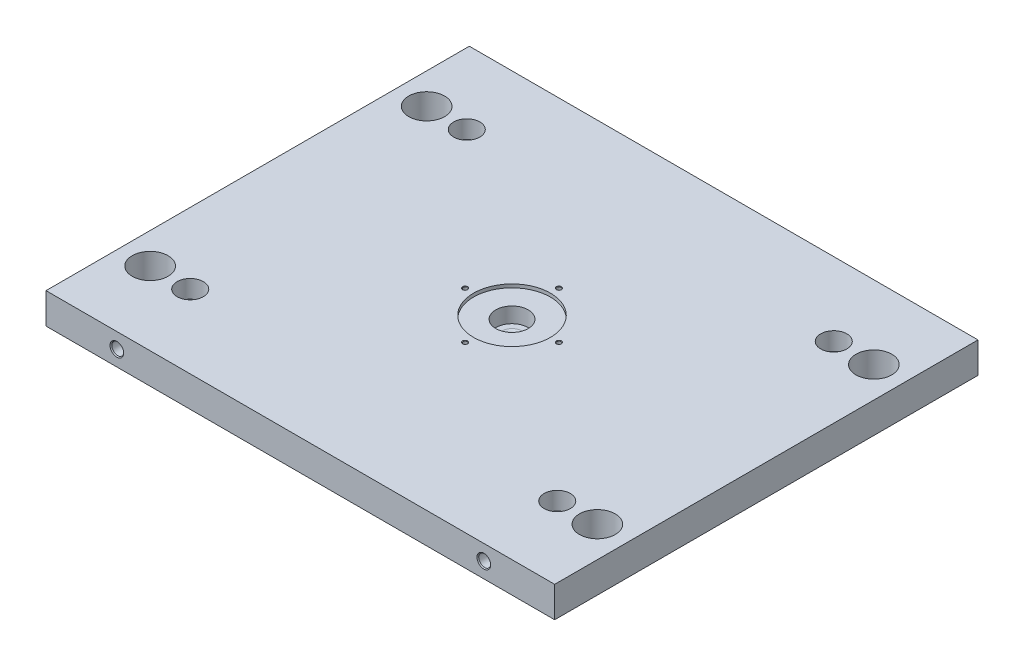
ISO-10303-21;
HEADER;
FILE_DESCRIPTION(('STEP AP214'),'2;1');
FILE_NAME('part.step','',(''),(''),'','','');
FILE_SCHEMA(('AUTOMOTIVE_DESIGN { 1 0 10303 214 1 1 1 1 }'));
ENDSEC;
DATA;
#1=APPLICATION_CONTEXT('core data for automotive mechanical design processes');
#2=APPLICATION_PROTOCOL_DEFINITION('international standard','automotive_design',2000,#1);
#3=PRODUCT_CONTEXT('',#1,'mechanical');
#4=PRODUCT('Part','Part','',(#3));
#5=PRODUCT_RELATED_PRODUCT_CATEGORY('part','',(#4));
#6=PRODUCT_DEFINITION_FORMATION('','',#4);
#7=PRODUCT_DEFINITION_CONTEXT('part definition',#1,'design');
#8=PRODUCT_DEFINITION('design','',#6,#7);
#9=PRODUCT_DEFINITION_SHAPE('','',#8);
#10=(LENGTH_UNIT() NAMED_UNIT(*) SI_UNIT(.MILLI.,.METRE.));
#11=(NAMED_UNIT(*) PLANE_ANGLE_UNIT() SI_UNIT($,.RADIAN.));
#12=(NAMED_UNIT(*) SI_UNIT($,.STERADIAN.) SOLID_ANGLE_UNIT());
#13=UNCERTAINTY_MEASURE_WITH_UNIT(LENGTH_MEASURE(1.E-05),#10,'distance_accuracy_value','');
#14=(GEOMETRIC_REPRESENTATION_CONTEXT(3) GLOBAL_UNCERTAINTY_ASSIGNED_CONTEXT((#13)) GLOBAL_UNIT_ASSIGNED_CONTEXT((#10,
#11,#12)) REPRESENTATION_CONTEXT('',''));
#15=CARTESIAN_POINT('',(0.,0.,0.));
#16=DIRECTION('',(0.,0.,1.));
#17=DIRECTION('',(1.,0.,0.));
#18=AXIS2_PLACEMENT_3D('',#15,#16,#17);
#19=CARTESIAN_POINT('',(298.,-36.,-248.));
#20=DIRECTION('',(0.,1.,0.));
#21=DIRECTION('',(0.,0.,1.));
#22=AXIS2_PLACEMENT_3D('',#19,#20,#21);
#23=CYLINDRICAL_SURFACE('',#22,8.99999999999999);
#24=CARTESIAN_POINT('',(298.,-25.,-248.));
#25=DIRECTION('',(0.,1.,0.));
#26=DIRECTION('',(0.,0.,1.));
#27=AXIS2_PLACEMENT_3D('',#24,#25,#26);
#28=CIRCLE('',#27,8.99999999999999);
#29=CARTESIAN_POINT('',(298.,-25.,-239.));
#30=VERTEX_POINT('',#29);
#31=EDGE_CURVE('E64',#30,#30,#28,.T.);
#32=ORIENTED_EDGE('',*,*,#31,.T.);
#33=EDGE_LOOP('',(#32));
#34=FACE_BOUND('',#33,.T.);
#35=CARTESIAN_POINT('',(298.,-36.,-248.));
#36=DIRECTION('',(0.,1.,0.));
#37=DIRECTION('',(0.,0.,1.));
#38=AXIS2_PLACEMENT_3D('',#35,#36,#37);
#39=CIRCLE('',#38,8.99999999999999);
#40=CARTESIAN_POINT('',(298.,-36.,-239.));
#41=VERTEX_POINT('',#40);
#42=EDGE_CURVE('E198',#41,#41,#39,.T.);
#43=ORIENTED_EDGE('',*,*,#42,.F.);
#44=EDGE_LOOP('',(#43));
#45=FACE_BOUND('',#44,.T.);
#46=ADVANCED_FACE('F55',(#34,#45),#23,.F.);
#47=CARTESIAN_POINT('',(596.,-36.,-2.22044604925031E-13));
#48=DIRECTION('',(-1.,0.,0.));
#49=DIRECTION('',(0.,0.,1.));
#50=AXIS2_PLACEMENT_3D('',#47,#48,#49);
#51=PLANE('',#50);
#52=DIRECTION('',(0.,0.,1.));
#53=VECTOR('',#52,1.);
#54=CARTESIAN_POINT('',(596.,0.,-2.22044604925031E-13));
#55=LINE('',#54,#53);
#56=CARTESIAN_POINT('',(596.,0.,-496.));
#57=VERTEX_POINT('',#56);
#58=CARTESIAN_POINT('',(596.,0.,0.));
#59=VERTEX_POINT('',#58);
#60=EDGE_CURVE('E283',#57,#59,#55,.T.);
#61=ORIENTED_EDGE('',*,*,#60,.T.);
#62=DIRECTION('',(0.,1.,0.));
#63=VECTOR('',#62,1.);
#64=CARTESIAN_POINT('',(596.,-36.,0.));
#65=LINE('',#64,#63);
#66=CARTESIAN_POINT('',(596.,-36.,0.));
#67=VERTEX_POINT('',#66);
#68=EDGE_CURVE('E97',#67,#59,#65,.T.);
#69=ORIENTED_EDGE('',*,*,#68,.F.);
#70=DIRECTION('',(0.,0.,1.));
#71=VECTOR('',#70,1.);
#72=CARTESIAN_POINT('',(596.,-36.,-2.22044604925031E-13));
#73=LINE('',#72,#71);
#74=CARTESIAN_POINT('',(596.,-36.,-496.));
#75=VERTEX_POINT('',#74);
#76=EDGE_CURVE('E72',#75,#67,#73,.T.);
#77=ORIENTED_EDGE('',*,*,#76,.F.);
#78=DIRECTION('',(0.,1.,0.));
#79=VECTOR('',#78,1.);
#80=CARTESIAN_POINT('',(596.,-36.,-496.));
#81=LINE('',#80,#79);
#82=EDGE_CURVE('E277',#75,#57,#81,.T.);
#83=ORIENTED_EDGE('',*,*,#82,.T.);
#84=EDGE_LOOP('',(#61,#69,#77,#83));
#85=FACE_BOUND('',#84,.T.);
#86=ADVANCED_FACE('F323',(#85),#51,.F.);
#87=CARTESIAN_POINT('',(0.,-36.,0.));
#88=DIRECTION('',(0.,0.,1.));
#89=DIRECTION('',(1.,0.,0.));
#90=AXIS2_PLACEMENT_3D('',#87,#88,#89);
#91=PLANE('',#90);
#92=CARTESIAN_POINT('',(83.,-18.,0.));
#93=DIRECTION('',(0.,0.,1.));
#94=DIRECTION('',(1.,0.,0.));
#95=AXIS2_PLACEMENT_3D('',#92,#93,#94);
#96=CIRCLE('',#95,8.025);
#97=CARTESIAN_POINT('',(91.025,-18.,0.));
#98=VERTEX_POINT('',#97);
#99=EDGE_CURVE('E143',#98,#98,#96,.T.);
#100=ORIENTED_EDGE('',*,*,#99,.F.);
#101=EDGE_LOOP('',(#100));
#102=FACE_BOUND('',#101,.T.);
#103=CARTESIAN_POINT('',(513.,-18.,0.));
#104=DIRECTION('',(0.,0.,1.));
#105=DIRECTION('',(1.,0.,0.));
#106=AXIS2_PLACEMENT_3D('',#103,#104,#105);
#107=CIRCLE('',#106,8.02499999999995);
#108=CARTESIAN_POINT('',(521.025,-18.,0.));
#109=VERTEX_POINT('',#108);
#110=EDGE_CURVE('E136',#109,#109,#107,.T.);
#111=ORIENTED_EDGE('',*,*,#110,.F.);
#112=EDGE_LOOP('',(#111));
#113=FACE_BOUND('',#112,.T.);
#114=DIRECTION('',(1.,0.,0.));
#115=VECTOR('',#114,1.);
#116=CARTESIAN_POINT('',(0.,0.,0.));
#117=LINE('',#116,#115);
#118=CARTESIAN_POINT('',(0.,0.,0.));
#119=VERTEX_POINT('',#118);
#120=EDGE_CURVE('E289',#119,#59,#117,.T.);
#121=ORIENTED_EDGE('',*,*,#120,.F.);
#122=DIRECTION('',(0.,1.,0.));
#123=VECTOR('',#122,1.);
#124=CARTESIAN_POINT('',(0.,-36.,0.));
#125=LINE('',#124,#123);
#126=CARTESIAN_POINT('',(0.,-36.,0.));
#127=VERTEX_POINT('',#126);
#128=EDGE_CURVE('E90',#127,#119,#125,.T.);
#129=ORIENTED_EDGE('',*,*,#128,.F.);
#130=DIRECTION('',(1.,0.,0.));
#131=VECTOR('',#130,1.);
#132=CARTESIAN_POINT('',(0.,-36.,0.));
#133=LINE('',#132,#131);
#134=EDGE_CURVE('E269',#127,#67,#133,.T.);
#135=ORIENTED_EDGE('',*,*,#134,.T.);
#136=ORIENTED_EDGE('',*,*,#68,.T.);
#137=EDGE_LOOP('',(#121,#129,#135,#136));
#138=FACE_BOUND('',#137,.T.);
#139=ADVANCED_FACE('F328',(#102,#113,#138),#91,.T.);
#140=CARTESIAN_POINT('',(0.,-36.,0.));
#141=DIRECTION('',(-1.,0.,0.));
#142=DIRECTION('',(0.,0.,1.));
#143=AXIS2_PLACEMENT_3D('',#140,#141,#142);
#144=PLANE('',#143);
#145=DIRECTION('',(0.,0.,1.));
#146=VECTOR('',#145,1.);
#147=CARTESIAN_POINT('',(0.,0.,0.));
#148=LINE('',#147,#146);
#149=CARTESIAN_POINT('',(0.,0.,-496.));
#150=VERTEX_POINT('',#149);
#151=EDGE_CURVE('E287',#150,#119,#148,.T.);
#152=ORIENTED_EDGE('',*,*,#151,.F.);
#153=DIRECTION('',(0.,1.,0.));
#154=VECTOR('',#153,1.);
#155=CARTESIAN_POINT('',(0.,-36.,-496.));
#156=LINE('',#155,#154);
#157=CARTESIAN_POINT('',(0.,-36.,-496.));
#158=VERTEX_POINT('',#157);
#159=EDGE_CURVE('E299',#158,#150,#156,.T.);
#160=ORIENTED_EDGE('',*,*,#159,.F.);
#161=DIRECTION('',(0.,0.,1.));
#162=VECTOR('',#161,1.);
#163=CARTESIAN_POINT('',(0.,-36.,0.));
#164=LINE('',#163,#162);
#165=EDGE_CURVE('E267',#158,#127,#164,.T.);
#166=ORIENTED_EDGE('',*,*,#165,.T.);
#167=ORIENTED_EDGE('',*,*,#128,.T.);
#168=EDGE_LOOP('',(#152,#160,#166,#167));
#169=FACE_BOUND('',#168,.T.);
#170=ADVANCED_FACE('F406',(#169),#144,.T.);
#171=CARTESIAN_POINT('',(560.,-36.,-86.0000000000001));
#172=DIRECTION('',(0.,1.,0.));
#173=DIRECTION('',(0.,0.,1.));
#174=AXIS2_PLACEMENT_3D('',#171,#172,#173);
#175=CYLINDRICAL_SURFACE('',#174,21.);
#176=CARTESIAN_POINT('',(560.,-36.,-86.0000000000001));
#177=DIRECTION('',(0.,1.,0.));
#178=DIRECTION('',(0.,0.,1.));
#179=AXIS2_PLACEMENT_3D('',#176,#177,#178);
#180=CIRCLE('',#179,21.);
#181=CARTESIAN_POINT('',(560.,-36.,-65.0000000000001));
#182=VERTEX_POINT('',#181);
#183=EDGE_CURVE('E271',#182,#182,#180,.T.);
#184=ORIENTED_EDGE('',*,*,#183,.F.);
#185=EDGE_LOOP('',(#184));
#186=FACE_BOUND('',#185,.T.);
#187=CARTESIAN_POINT('',(560.,0.,-86.0000000000001));
#188=DIRECTION('',(0.,1.,0.));
#189=DIRECTION('',(0.,0.,1.));
#190=AXIS2_PLACEMENT_3D('',#187,#188,#189);
#191=CIRCLE('',#190,21.);
#192=CARTESIAN_POINT('',(560.,0.,-65.0000000000001));
#193=VERTEX_POINT('',#192);
#194=EDGE_CURVE('E292',#193,#193,#191,.T.);
#195=ORIENTED_EDGE('',*,*,#194,.T.);
#196=EDGE_LOOP('',(#195));
#197=FACE_BOUND('',#196,.T.);
#198=ADVANCED_FACE('F402',(#186,#197),#175,.F.);
#199=CARTESIAN_POINT('',(0.,-36.,-496.));
#200=DIRECTION('',(0.,0.,1.));
#201=DIRECTION('',(1.,0.,0.));
#202=AXIS2_PLACEMENT_3D('',#199,#200,#201);
#203=PLANE('',#202);
#204=DIRECTION('',(1.,0.,0.));
#205=VECTOR('',#204,1.);
#206=CARTESIAN_POINT('',(0.,0.,-496.));
#207=LINE('',#206,#205);
#208=EDGE_CURVE('E285',#150,#57,#207,.T.);
#209=ORIENTED_EDGE('',*,*,#208,.T.);
#210=ORIENTED_EDGE('',*,*,#82,.F.);
#211=DIRECTION('',(1.,0.,0.));
#212=VECTOR('',#211,1.);
#213=CARTESIAN_POINT('',(0.,-36.,-496.));
#214=LINE('',#213,#212);
#215=EDGE_CURVE('E102',#158,#75,#214,.T.);
#216=ORIENTED_EDGE('',*,*,#215,.F.);
#217=ORIENTED_EDGE('',*,*,#159,.T.);
#218=EDGE_LOOP('',(#209,#210,#216,#217));
#219=FACE_BOUND('',#218,.T.);
#220=ADVANCED_FACE('F405',(#219),#203,.F.);
#221=CARTESIAN_POINT('',(36.0000000000001,-36.,-410.));
#222=DIRECTION('',(0.,1.,0.));
#223=DIRECTION('',(0.,0.,1.));
#224=AXIS2_PLACEMENT_3D('',#221,#222,#223);
#225=CYLINDRICAL_SURFACE('',#224,21.);
#226=CARTESIAN_POINT('',(36.0000000000001,-36.,-410.));
#227=DIRECTION('',(0.,1.,0.));
#228=DIRECTION('',(0.,0.,1.));
#229=AXIS2_PLACEMENT_3D('',#226,#227,#228);
#230=CIRCLE('',#229,21.);
#231=CARTESIAN_POINT('',(36.0000000000001,-36.,-389.));
#232=VERTEX_POINT('',#231);
#233=EDGE_CURVE('E261',#232,#232,#230,.T.);
#234=ORIENTED_EDGE('',*,*,#233,.F.);
#235=EDGE_LOOP('',(#234));
#236=FACE_BOUND('',#235,.T.);
#237=CARTESIAN_POINT('',(36.0000000000001,0.,-410.));
#238=DIRECTION('',(0.,1.,0.));
#239=DIRECTION('',(0.,0.,1.));
#240=AXIS2_PLACEMENT_3D('',#237,#238,#239);
#241=CIRCLE('',#240,21.);
#242=CARTESIAN_POINT('',(36.0000000000001,0.,-389.));
#243=VERTEX_POINT('',#242);
#244=EDGE_CURVE('E280',#243,#243,#241,.T.);
#245=ORIENTED_EDGE('',*,*,#244,.T.);
#246=EDGE_LOOP('',(#245));
#247=FACE_BOUND('',#246,.T.);
#248=ADVANCED_FACE('F414',(#236,#247),#225,.F.);
#249=CARTESIAN_POINT('',(560.,-36.,-410.));
#250=DIRECTION('',(0.,1.,0.));
#251=DIRECTION('',(0.,0.,1.));
#252=AXIS2_PLACEMENT_3D('',#249,#250,#251);
#253=CYLINDRICAL_SURFACE('',#252,21.);
#254=CARTESIAN_POINT('',(560.,-36.,-410.));
#255=DIRECTION('',(0.,1.,0.));
#256=DIRECTION('',(0.,0.,1.));
#257=AXIS2_PLACEMENT_3D('',#254,#255,#256);
#258=CIRCLE('',#257,21.);
#259=CARTESIAN_POINT('',(560.,-36.,-389.));
#260=VERTEX_POINT('',#259);
#261=EDGE_CURVE('E258',#260,#260,#258,.F.);
#262=ORIENTED_EDGE('',*,*,#261,.T.);
#263=EDGE_LOOP('',(#262));
#264=FACE_BOUND('',#263,.T.);
#265=CARTESIAN_POINT('',(560.,0.,-410.));
#266=DIRECTION('',(0.,1.,0.));
#267=DIRECTION('',(0.,0.,1.));
#268=AXIS2_PLACEMENT_3D('',#265,#266,#267);
#269=CIRCLE('',#268,21.);
#270=CARTESIAN_POINT('',(560.,0.,-389.));
#271=VERTEX_POINT('',#270);
#272=EDGE_CURVE('E255',#271,#271,#269,.F.);
#273=ORIENTED_EDGE('',*,*,#272,.F.);
#274=EDGE_LOOP('',(#273));
#275=FACE_BOUND('',#274,.T.);
#276=ADVANCED_FACE('F400',(#264,#275),#253,.F.);
#277=CARTESIAN_POINT('',(36.0000000000001,-36.,-86.0000000000001));
#278=DIRECTION('',(0.,1.,0.));
#279=DIRECTION('',(0.,0.,1.));
#280=AXIS2_PLACEMENT_3D('',#277,#278,#279);
#281=CYLINDRICAL_SURFACE('',#280,21.);
#282=CARTESIAN_POINT('',(36.0000000000001,-36.,-86.0000000000001));
#283=DIRECTION('',(0.,1.,0.));
#284=DIRECTION('',(0.,0.,1.));
#285=AXIS2_PLACEMENT_3D('',#282,#283,#284);
#286=CIRCLE('',#285,21.);
#287=CARTESIAN_POINT('',(36.0000000000001,-36.,-65.0000000000001));
#288=VERTEX_POINT('',#287);
#289=EDGE_CURVE('E274',#288,#288,#286,.F.);
#290=ORIENTED_EDGE('',*,*,#289,.T.);
#291=EDGE_LOOP('',(#290));
#292=FACE_BOUND('',#291,.T.);
#293=CARTESIAN_POINT('',(36.0000000000001,0.,-86.0000000000001));
#294=DIRECTION('',(0.,1.,0.));
#295=DIRECTION('',(0.,0.,1.));
#296=AXIS2_PLACEMENT_3D('',#293,#294,#295);
#297=CIRCLE('',#296,21.);
#298=CARTESIAN_POINT('',(36.0000000000001,0.,-65.0000000000001));
#299=VERTEX_POINT('',#298);
#300=EDGE_CURVE('E262',#299,#299,#297,.F.);
#301=ORIENTED_EDGE('',*,*,#300,.F.);
#302=EDGE_LOOP('',(#301));
#303=FACE_BOUND('',#302,.T.);
#304=ADVANCED_FACE('F393',(#292,#303),#281,.F.);
#305=CARTESIAN_POINT('',(0.,-36.,0.));
#306=DIRECTION('',(0.,1.,0.));
#307=DIRECTION('',(0.,0.,1.));
#308=AXIS2_PLACEMENT_3D('',#305,#306,#307);
#309=PLANE('',#308);
#310=ORIENTED_EDGE('',*,*,#42,.T.);
#311=EDGE_LOOP('',(#310));
#312=FACE_BOUND('',#311,.T.);
#313=CARTESIAN_POINT('',(83.,-36.,-410.));
#314=DIRECTION('',(0.,1.,0.));
#315=DIRECTION('',(0.,0.,1.));
#316=AXIS2_PLACEMENT_3D('',#313,#314,#315);
#317=CIRCLE('',#316,8.74999999999999);
#318=CARTESIAN_POINT('',(83.,-36.,-401.25));
#319=VERTEX_POINT('',#318);
#320=EDGE_CURVE('E212',#319,#319,#317,.T.);
#321=ORIENTED_EDGE('',*,*,#320,.T.);
#322=EDGE_LOOP('',(#321));
#323=FACE_BOUND('',#322,.T.);
#324=CARTESIAN_POINT('',(513.,-36.,-410.));
#325=DIRECTION('',(0.,1.,0.));
#326=DIRECTION('',(0.,0.,1.));
#327=AXIS2_PLACEMENT_3D('',#324,#325,#326);
#328=CIRCLE('',#327,8.75000000000004);
#329=CARTESIAN_POINT('',(513.,-36.,-401.25));
#330=VERTEX_POINT('',#329);
#331=EDGE_CURVE('E224',#330,#330,#328,.T.);
#332=ORIENTED_EDGE('',*,*,#331,.T.);
#333=EDGE_LOOP('',(#332));
#334=FACE_BOUND('',#333,.T.);
#335=CARTESIAN_POINT('',(513.,-36.,-86.0000000000001));
#336=DIRECTION('',(0.,1.,0.));
#337=DIRECTION('',(0.,0.,1.));
#338=AXIS2_PLACEMENT_3D('',#335,#336,#337);
#339=CIRCLE('',#338,8.75000000000004);
#340=CARTESIAN_POINT('',(513.,-36.,-77.25));
#341=VERTEX_POINT('',#340);
#342=EDGE_CURVE('E236',#341,#341,#339,.T.);
#343=ORIENTED_EDGE('',*,*,#342,.T.);
#344=EDGE_LOOP('',(#343));
#345=FACE_BOUND('',#344,.T.);
#346=CARTESIAN_POINT('',(83.0000000000001,-36.,-86.0000000000001));
#347=DIRECTION('',(0.,1.,0.));
#348=DIRECTION('',(0.,0.,1.));
#349=AXIS2_PLACEMENT_3D('',#346,#347,#348);
#350=CIRCLE('',#349,8.74999999999999);
#351=CARTESIAN_POINT('',(83.0000000000001,-36.,-77.2500000000001));
#352=VERTEX_POINT('',#351);
#353=EDGE_CURVE('E248',#352,#352,#350,.T.);
#354=ORIENTED_EDGE('',*,*,#353,.T.);
#355=EDGE_LOOP('',(#354));
#356=FACE_BOUND('',#355,.T.);
#357=ORIENTED_EDGE('',*,*,#261,.F.);
#358=EDGE_LOOP('',(#357));
#359=FACE_BOUND('',#358,.T.);
#360=ORIENTED_EDGE('',*,*,#233,.T.);
#361=EDGE_LOOP('',(#360));
#362=FACE_BOUND('',#361,.T.);
#363=ORIENTED_EDGE('',*,*,#76,.T.);
#364=ORIENTED_EDGE('',*,*,#134,.F.);
#365=ORIENTED_EDGE('',*,*,#165,.F.);
#366=ORIENTED_EDGE('',*,*,#215,.T.);
#367=EDGE_LOOP('',(#363,#364,#365,#366));
#368=FACE_BOUND('',#367,.T.);
#369=ORIENTED_EDGE('',*,*,#183,.T.);
#370=EDGE_LOOP('',(#369));
#371=FACE_BOUND('',#370,.T.);
#372=ORIENTED_EDGE('',*,*,#289,.F.);
#373=EDGE_LOOP('',(#372));
#374=FACE_BOUND('',#373,.T.);
#375=ADVANCED_FACE('F390',(#312,#323,#334,#345,#356,#359,#362,#368,#371,#374),#309,.F.);
#376=CARTESIAN_POINT('',(0.,0.,0.));
#377=DIRECTION('',(0.,1.,0.));
#378=DIRECTION('',(0.,0.,1.));
#379=AXIS2_PLACEMENT_3D('',#376,#377,#378);
#380=PLANE('',#379);
#381=CARTESIAN_POINT('',(243.,0.,-248.));
#382=DIRECTION('',(0.,1.,0.));
#383=DIRECTION('',(0.,0.,1.));
#384=AXIS2_PLACEMENT_3D('',#381,#382,#383);
#385=CIRCLE('',#384,3.025);
#386=CARTESIAN_POINT('',(243.,0.,-244.975));
#387=VERTEX_POINT('',#386);
#388=EDGE_CURVE('E152',#387,#387,#385,.T.);
#389=ORIENTED_EDGE('',*,*,#388,.F.);
#390=EDGE_LOOP('',(#389));
#391=FACE_BOUND('',#390,.T.);
#392=CARTESIAN_POINT('',(298.,0.,-303.));
#393=DIRECTION('',(0.,1.,0.));
#394=DIRECTION('',(0.,0.,1.));
#395=AXIS2_PLACEMENT_3D('',#392,#393,#394);
#396=CIRCLE('',#395,3.025);
#397=CARTESIAN_POINT('',(298.,0.,-299.975));
#398=VERTEX_POINT('',#397);
#399=EDGE_CURVE('E161',#398,#398,#396,.T.);
#400=ORIENTED_EDGE('',*,*,#399,.F.);
#401=EDGE_LOOP('',(#400));
#402=FACE_BOUND('',#401,.T.);
#403=CARTESIAN_POINT('',(353.,0.,-248.));
#404=DIRECTION('',(0.,1.,0.));
#405=DIRECTION('',(0.,0.,1.));
#406=AXIS2_PLACEMENT_3D('',#403,#404,#405);
#407=CIRCLE('',#406,3.025);
#408=CARTESIAN_POINT('',(353.,0.,-244.975));
#409=VERTEX_POINT('',#408);
#410=EDGE_CURVE('E170',#409,#409,#407,.T.);
#411=ORIENTED_EDGE('',*,*,#410,.F.);
#412=EDGE_LOOP('',(#411));
#413=FACE_BOUND('',#412,.T.);
#414=CARTESIAN_POINT('',(298.,0.,-193.));
#415=DIRECTION('',(0.,1.,0.));
#416=DIRECTION('',(0.,0.,1.));
#417=AXIS2_PLACEMENT_3D('',#414,#415,#416);
#418=CIRCLE('',#417,3.025);
#419=CARTESIAN_POINT('',(298.,0.,-189.975));
#420=VERTEX_POINT('',#419);
#421=EDGE_CURVE('E179',#420,#420,#418,.T.);
#422=ORIENTED_EDGE('',*,*,#421,.F.);
#423=EDGE_LOOP('',(#422));
#424=FACE_BOUND('',#423,.T.);
#425=CARTESIAN_POINT('',(83.,0.,-410.));
#426=DIRECTION('',(0.,1.,0.));
#427=DIRECTION('',(0.,0.,1.));
#428=AXIS2_PLACEMENT_3D('',#425,#426,#427);
#429=CIRCLE('',#428,15.3565);
#430=CARTESIAN_POINT('',(83.,0.,-394.6435));
#431=VERTEX_POINT('',#430);
#432=EDGE_CURVE('E203',#431,#431,#429,.T.);
#433=ORIENTED_EDGE('',*,*,#432,.F.);
#434=EDGE_LOOP('',(#433));
#435=FACE_BOUND('',#434,.T.);
#436=CARTESIAN_POINT('',(513.,0.,-410.));
#437=DIRECTION('',(0.,1.,0.));
#438=DIRECTION('',(0.,0.,1.));
#439=AXIS2_PLACEMENT_3D('',#436,#437,#438);
#440=CIRCLE('',#439,15.3565);
#441=CARTESIAN_POINT('',(513.,0.,-394.6435));
#442=VERTEX_POINT('',#441);
#443=EDGE_CURVE('E215',#442,#442,#440,.T.);
#444=ORIENTED_EDGE('',*,*,#443,.F.);
#445=EDGE_LOOP('',(#444));
#446=FACE_BOUND('',#445,.T.);
#447=CARTESIAN_POINT('',(513.,0.,-86.0000000000001));
#448=DIRECTION('',(0.,1.,0.));
#449=DIRECTION('',(0.,0.,1.));
#450=AXIS2_PLACEMENT_3D('',#447,#448,#449);
#451=CIRCLE('',#450,15.3565);
#452=CARTESIAN_POINT('',(513.,0.,-70.6435000000001));
#453=VERTEX_POINT('',#452);
#454=EDGE_CURVE('E227',#453,#453,#451,.T.);
#455=ORIENTED_EDGE('',*,*,#454,.F.);
#456=EDGE_LOOP('',(#455));
#457=FACE_BOUND('',#456,.T.);
#458=CARTESIAN_POINT('',(83.0000000000001,0.,-86.0000000000001));
#459=DIRECTION('',(0.,1.,0.));
#460=DIRECTION('',(0.,0.,1.));
#461=AXIS2_PLACEMENT_3D('',#458,#459,#460);
#462=CIRCLE('',#461,15.3565);
#463=CARTESIAN_POINT('',(83.0000000000001,0.,-70.6435000000001));
#464=VERTEX_POINT('',#463);
#465=EDGE_CURVE('E239',#464,#464,#462,.T.);
#466=ORIENTED_EDGE('',*,*,#465,.F.);
#467=EDGE_LOOP('',(#466));
#468=FACE_BOUND('',#467,.T.);
#469=CARTESIAN_POINT('',(298.,0.,-248.));
#470=DIRECTION('',(0.,1.,0.));
#471=DIRECTION('',(0.,0.,1.));
#472=AXIS2_PLACEMENT_3D('',#469,#470,#471);
#473=CIRCLE('',#472,45.);
#474=CARTESIAN_POINT('',(298.,0.,-203.));
#475=VERTEX_POINT('',#474);
#476=EDGE_CURVE('E251',#475,#475,#473,.T.);
#477=ORIENTED_EDGE('',*,*,#476,.F.);
#478=EDGE_LOOP('',(#477));
#479=FACE_BOUND('',#478,.T.);
#480=ORIENTED_EDGE('',*,*,#272,.T.);
#481=EDGE_LOOP('',(#480));
#482=FACE_BOUND('',#481,.T.);
#483=ORIENTED_EDGE('',*,*,#244,.F.);
#484=EDGE_LOOP('',(#483));
#485=FACE_BOUND('',#484,.T.);
#486=ORIENTED_EDGE('',*,*,#60,.F.);
#487=ORIENTED_EDGE('',*,*,#208,.F.);
#488=ORIENTED_EDGE('',*,*,#151,.T.);
#489=ORIENTED_EDGE('',*,*,#120,.T.);
#490=EDGE_LOOP('',(#486,#487,#488,#489));
#491=FACE_BOUND('',#490,.T.);
#492=ORIENTED_EDGE('',*,*,#194,.F.);
#493=EDGE_LOOP('',(#492));
#494=FACE_BOUND('',#493,.T.);
#495=ORIENTED_EDGE('',*,*,#300,.T.);
#496=EDGE_LOOP('',(#495));
#497=FACE_BOUND('',#496,.T.);
#498=ADVANCED_FACE('F388',(#391,#402,#413,#424,#435,#446,#457,#468,#479,#482,#485,#491,#494,
#497),#380,.T.);
#499=CARTESIAN_POINT('',(298.,-4.,-248.));
#500=DIRECTION('',(0.,1.,0.));
#501=DIRECTION('',(0.,0.,1.));
#502=AXIS2_PLACEMENT_3D('',#499,#500,#501);
#503=CYLINDRICAL_SURFACE('',#502,45.);
#504=CARTESIAN_POINT('',(298.,-4.,-248.));
#505=DIRECTION('',(0.,1.,0.));
#506=DIRECTION('',(0.,0.,1.));
#507=AXIS2_PLACEMENT_3D('',#504,#505,#506);
#508=CIRCLE('',#507,45.);
#509=CARTESIAN_POINT('',(298.,-4.,-203.));
#510=VERTEX_POINT('',#509);
#511=EDGE_CURVE('E252',#510,#510,#508,.T.);
#512=ORIENTED_EDGE('',*,*,#511,.F.);
#513=EDGE_LOOP('',(#512));
#514=FACE_BOUND('',#513,.T.);
#515=ORIENTED_EDGE('',*,*,#476,.T.);
#516=EDGE_LOOP('',(#515));
#517=FACE_BOUND('',#516,.T.);
#518=ADVANCED_FACE('F384',(#514,#517),#503,.F.);
#519=CARTESIAN_POINT('',(0.,-4.,0.));
#520=DIRECTION('',(0.,1.,0.));
#521=DIRECTION('',(0.,0.,1.));
#522=AXIS2_PLACEMENT_3D('',#519,#520,#521);
#523=PLANE('',#522);
#524=CARTESIAN_POINT('',(298.,-4.,-248.));
#525=DIRECTION('',(0.,1.,0.));
#526=DIRECTION('',(0.,0.,1.));
#527=AXIS2_PLACEMENT_3D('',#524,#525,#526);
#528=CIRCLE('',#527,19.);
#529=CARTESIAN_POINT('',(298.,-4.,-229.));
#530=VERTEX_POINT('',#529);
#531=EDGE_CURVE('E194',#530,#530,#528,.T.);
#532=ORIENTED_EDGE('',*,*,#531,.F.);
#533=EDGE_LOOP('',(#532));
#534=FACE_BOUND('',#533,.T.);
#535=ORIENTED_EDGE('',*,*,#511,.T.);
#536=EDGE_LOOP('',(#535));
#537=FACE_BOUND('',#536,.T.);
#538=ADVANCED_FACE('F380',(#534,#537),#523,.T.);
#539=CARTESIAN_POINT('',(83.0000000000001,0.,-86.0000000000001));
#540=DIRECTION('',(0.,1.,0.));
#541=DIRECTION('',(0.,0.,1.));
#542=AXIS2_PLACEMENT_3D('',#539,#540,#541);
#543=CYLINDRICAL_SURFACE('',#542,8.74999999999999);
#544=ORIENTED_EDGE('',*,*,#353,.F.);
#545=EDGE_LOOP('',(#544));
#546=FACE_BOUND('',#545,.T.);
#547=CARTESIAN_POINT('',(83.0000000000001,-21.,-86.0000000000001));
#548=DIRECTION('',(0.,1.,0.));
#549=DIRECTION('',(0.,0.,1.));
#550=AXIS2_PLACEMENT_3D('',#547,#548,#549);
#551=CIRCLE('',#550,8.74999999999999);
#552=CARTESIAN_POINT('',(83.0000000000001,-21.,-77.2500000000001));
#553=VERTEX_POINT('',#552);
#554=EDGE_CURVE('E245',#553,#553,#551,.T.);
#555=ORIENTED_EDGE('',*,*,#554,.T.);
#556=EDGE_LOOP('',(#555));
#557=FACE_BOUND('',#556,.T.);
#558=ADVANCED_FACE('F376',(#546,#557),#543,.F.);
#559=CARTESIAN_POINT('',(91.7500000000001,-21.,-86.0000000000001));
#560=DIRECTION('',(0.,-1.,0.));
#561=DIRECTION('',(0.,0.,-1.));
#562=AXIS2_PLACEMENT_3D('',#559,#560,#561);
#563=PLANE('',#562);
#564=ORIENTED_EDGE('',*,*,#554,.F.);
#565=EDGE_LOOP('',(#564));
#566=FACE_BOUND('',#565,.T.);
#567=CARTESIAN_POINT('',(83.0000000000001,-21.,-86.0000000000001));
#568=DIRECTION('',(0.,1.,0.));
#569=DIRECTION('',(0.,0.,1.));
#570=AXIS2_PLACEMENT_3D('',#567,#568,#569);
#571=CIRCLE('',#570,15.3565);
#572=CARTESIAN_POINT('',(83.0000000000001,-21.,-70.6435000000001));
#573=VERTEX_POINT('',#572);
#574=EDGE_CURVE('E242',#573,#573,#571,.T.);
#575=ORIENTED_EDGE('',*,*,#574,.T.);
#576=EDGE_LOOP('',(#575));
#577=FACE_BOUND('',#576,.T.);
#578=ADVANCED_FACE('F372',(#566,#577),#563,.F.);
#579=CARTESIAN_POINT('',(83.0000000000001,0.,-86.0000000000001));
#580=DIRECTION('',(0.,1.,0.));
#581=DIRECTION('',(0.,0.,1.));
#582=AXIS2_PLACEMENT_3D('',#579,#580,#581);
#583=CYLINDRICAL_SURFACE('',#582,15.3565);
#584=ORIENTED_EDGE('',*,*,#574,.F.);
#585=EDGE_LOOP('',(#584));
#586=FACE_BOUND('',#585,.T.);
#587=ORIENTED_EDGE('',*,*,#465,.T.);
#588=EDGE_LOOP('',(#587));
#589=FACE_BOUND('',#588,.T.);
#590=ADVANCED_FACE('F368',(#586,#589),#583,.F.);
#591=CARTESIAN_POINT('',(513.,0.,-86.0000000000001));
#592=DIRECTION('',(0.,1.,0.));
#593=DIRECTION('',(0.,0.,1.));
#594=AXIS2_PLACEMENT_3D('',#591,#592,#593);
#595=CYLINDRICAL_SURFACE('',#594,8.75000000000004);
#596=ORIENTED_EDGE('',*,*,#342,.F.);
#597=EDGE_LOOP('',(#596));
#598=FACE_BOUND('',#597,.T.);
#599=CARTESIAN_POINT('',(513.,-21.,-86.0000000000001));
#600=DIRECTION('',(0.,1.,0.));
#601=DIRECTION('',(0.,0.,1.));
#602=AXIS2_PLACEMENT_3D('',#599,#600,#601);
#603=CIRCLE('',#602,8.75000000000004);
#604=CARTESIAN_POINT('',(513.,-21.,-77.25));
#605=VERTEX_POINT('',#604);
#606=EDGE_CURVE('E233',#605,#605,#603,.T.);
#607=ORIENTED_EDGE('',*,*,#606,.T.);
#608=EDGE_LOOP('',(#607));
#609=FACE_BOUND('',#608,.T.);
#610=ADVANCED_FACE('F364',(#598,#609),#595,.F.);
#611=CARTESIAN_POINT('',(521.75,-21.,-86.0000000000001));
#612=DIRECTION('',(0.,-1.,0.));
#613=DIRECTION('',(0.,0.,-1.));
#614=AXIS2_PLACEMENT_3D('',#611,#612,#613);
#615=PLANE('',#614);
#616=ORIENTED_EDGE('',*,*,#606,.F.);
#617=EDGE_LOOP('',(#616));
#618=FACE_BOUND('',#617,.T.);
#619=CARTESIAN_POINT('',(513.,-21.,-86.0000000000001));
#620=DIRECTION('',(0.,1.,0.));
#621=DIRECTION('',(0.,0.,1.));
#622=AXIS2_PLACEMENT_3D('',#619,#620,#621);
#623=CIRCLE('',#622,15.3565);
#624=CARTESIAN_POINT('',(513.,-21.,-70.6435000000001));
#625=VERTEX_POINT('',#624);
#626=EDGE_CURVE('E230',#625,#625,#623,.T.);
#627=ORIENTED_EDGE('',*,*,#626,.T.);
#628=EDGE_LOOP('',(#627));
#629=FACE_BOUND('',#628,.T.);
#630=ADVANCED_FACE('F360',(#618,#629),#615,.F.);
#631=CARTESIAN_POINT('',(513.,0.,-86.0000000000001));
#632=DIRECTION('',(0.,1.,0.));
#633=DIRECTION('',(0.,0.,1.));
#634=AXIS2_PLACEMENT_3D('',#631,#632,#633);
#635=CYLINDRICAL_SURFACE('',#634,15.3565);
#636=ORIENTED_EDGE('',*,*,#626,.F.);
#637=EDGE_LOOP('',(#636));
#638=FACE_BOUND('',#637,.T.);
#639=ORIENTED_EDGE('',*,*,#454,.T.);
#640=EDGE_LOOP('',(#639));
#641=FACE_BOUND('',#640,.T.);
#642=ADVANCED_FACE('F356',(#638,#641),#635,.F.);
#643=CARTESIAN_POINT('',(513.,0.,-410.));
#644=DIRECTION('',(0.,1.,0.));
#645=DIRECTION('',(0.,0.,1.));
#646=AXIS2_PLACEMENT_3D('',#643,#644,#645);
#647=CYLINDRICAL_SURFACE('',#646,8.75000000000004);
#648=ORIENTED_EDGE('',*,*,#331,.F.);
#649=EDGE_LOOP('',(#648));
#650=FACE_BOUND('',#649,.T.);
#651=CARTESIAN_POINT('',(513.,-21.,-410.));
#652=DIRECTION('',(0.,1.,0.));
#653=DIRECTION('',(0.,0.,1.));
#654=AXIS2_PLACEMENT_3D('',#651,#652,#653);
#655=CIRCLE('',#654,8.75000000000004);
#656=CARTESIAN_POINT('',(513.,-21.,-401.25));
#657=VERTEX_POINT('',#656);
#658=EDGE_CURVE('E221',#657,#657,#655,.T.);
#659=ORIENTED_EDGE('',*,*,#658,.T.);
#660=EDGE_LOOP('',(#659));
#661=FACE_BOUND('',#660,.T.);
#662=ADVANCED_FACE('F352',(#650,#661),#647,.F.);
#663=CARTESIAN_POINT('',(521.75,-21.,-410.));
#664=DIRECTION('',(0.,-1.,0.));
#665=DIRECTION('',(0.,0.,-1.));
#666=AXIS2_PLACEMENT_3D('',#663,#664,#665);
#667=PLANE('',#666);
#668=ORIENTED_EDGE('',*,*,#658,.F.);
#669=EDGE_LOOP('',(#668));
#670=FACE_BOUND('',#669,.T.);
#671=CARTESIAN_POINT('',(513.,-21.,-410.));
#672=DIRECTION('',(0.,1.,0.));
#673=DIRECTION('',(0.,0.,1.));
#674=AXIS2_PLACEMENT_3D('',#671,#672,#673);
#675=CIRCLE('',#674,15.3565);
#676=CARTESIAN_POINT('',(513.,-21.,-394.6435));
#677=VERTEX_POINT('',#676);
#678=EDGE_CURVE('E218',#677,#677,#675,.T.);
#679=ORIENTED_EDGE('',*,*,#678,.T.);
#680=EDGE_LOOP('',(#679));
#681=FACE_BOUND('',#680,.T.);
#682=ADVANCED_FACE('F348',(#670,#681),#667,.F.);
#683=CARTESIAN_POINT('',(513.,0.,-410.));
#684=DIRECTION('',(0.,1.,0.));
#685=DIRECTION('',(0.,0.,1.));
#686=AXIS2_PLACEMENT_3D('',#683,#684,#685);
#687=CYLINDRICAL_SURFACE('',#686,15.3565);
#688=ORIENTED_EDGE('',*,*,#678,.F.);
#689=EDGE_LOOP('',(#688));
#690=FACE_BOUND('',#689,.T.);
#691=ORIENTED_EDGE('',*,*,#443,.T.);
#692=EDGE_LOOP('',(#691));
#693=FACE_BOUND('',#692,.T.);
#694=ADVANCED_FACE('F344',(#690,#693),#687,.F.);
#695=CARTESIAN_POINT('',(83.,0.,-410.));
#696=DIRECTION('',(0.,1.,0.));
#697=DIRECTION('',(0.,0.,1.));
#698=AXIS2_PLACEMENT_3D('',#695,#696,#697);
#699=CYLINDRICAL_SURFACE('',#698,8.74999999999999);
#700=ORIENTED_EDGE('',*,*,#320,.F.);
#701=EDGE_LOOP('',(#700));
#702=FACE_BOUND('',#701,.T.);
#703=CARTESIAN_POINT('',(83.,-21.,-410.));
#704=DIRECTION('',(0.,1.,0.));
#705=DIRECTION('',(0.,0.,1.));
#706=AXIS2_PLACEMENT_3D('',#703,#704,#705);
#707=CIRCLE('',#706,8.74999999999999);
#708=CARTESIAN_POINT('',(83.,-21.,-401.25));
#709=VERTEX_POINT('',#708);
#710=EDGE_CURVE('E209',#709,#709,#707,.T.);
#711=ORIENTED_EDGE('',*,*,#710,.T.);
#712=EDGE_LOOP('',(#711));
#713=FACE_BOUND('',#712,.T.);
#714=ADVANCED_FACE('F340',(#702,#713),#699,.F.);
#715=CARTESIAN_POINT('',(91.7500000000001,-21.,-410.));
#716=DIRECTION('',(0.,-1.,0.));
#717=DIRECTION('',(0.,0.,-1.));
#718=AXIS2_PLACEMENT_3D('',#715,#716,#717);
#719=PLANE('',#718);
#720=ORIENTED_EDGE('',*,*,#710,.F.);
#721=EDGE_LOOP('',(#720));
#722=FACE_BOUND('',#721,.T.);
#723=CARTESIAN_POINT('',(83.,-21.,-410.));
#724=DIRECTION('',(0.,1.,0.));
#725=DIRECTION('',(0.,0.,1.));
#726=AXIS2_PLACEMENT_3D('',#723,#724,#725);
#727=CIRCLE('',#726,15.3565);
#728=CARTESIAN_POINT('',(83.,-21.,-394.6435));
#729=VERTEX_POINT('',#728);
#730=EDGE_CURVE('E206',#729,#729,#727,.T.);
#731=ORIENTED_EDGE('',*,*,#730,.T.);
#732=EDGE_LOOP('',(#731));
#733=FACE_BOUND('',#732,.T.);
#734=ADVANCED_FACE('F336',(#722,#733),#719,.F.);
#735=CARTESIAN_POINT('',(83.,0.,-410.));
#736=DIRECTION('',(0.,1.,0.));
#737=DIRECTION('',(0.,0.,1.));
#738=AXIS2_PLACEMENT_3D('',#735,#736,#737);
#739=CYLINDRICAL_SURFACE('',#738,15.3565);
#740=ORIENTED_EDGE('',*,*,#730,.F.);
#741=EDGE_LOOP('',(#740));
#742=FACE_BOUND('',#741,.T.);
#743=ORIENTED_EDGE('',*,*,#432,.T.);
#744=EDGE_LOOP('',(#743));
#745=FACE_BOUND('',#744,.T.);
#746=ADVANCED_FACE('F333',(#742,#745),#739,.F.);
#747=CARTESIAN_POINT('',(298.,-22.,-248.));
#748=DIRECTION('',(0.,1.,0.));
#749=DIRECTION('',(0.,0.,1.));
#750=AXIS2_PLACEMENT_3D('',#747,#748,#749);
#751=CYLINDRICAL_SURFACE('',#750,19.);
#752=CARTESIAN_POINT('',(298.,-22.,-248.));
#753=DIRECTION('',(0.,1.,0.));
#754=DIRECTION('',(0.,0.,1.));
#755=AXIS2_PLACEMENT_3D('',#752,#753,#754);
#756=CIRCLE('',#755,19.);
#757=CARTESIAN_POINT('',(298.,-22.,-229.));
#758=VERTEX_POINT('',#757);
#759=EDGE_CURVE('E195',#758,#758,#756,.T.);
#760=ORIENTED_EDGE('',*,*,#759,.F.);
#761=EDGE_LOOP('',(#760));
#762=FACE_BOUND('',#761,.T.);
#763=ORIENTED_EDGE('',*,*,#531,.T.);
#764=EDGE_LOOP('',(#763));
#765=FACE_BOUND('',#764,.T.);
#766=ADVANCED_FACE('F318',(#762,#765),#751,.F.);
#767=CARTESIAN_POINT('',(298.,-22.,-248.));
#768=DIRECTION('',(0.,1.,0.));
#769=DIRECTION('',(0.,0.,1.));
#770=AXIS2_PLACEMENT_3D('',#767,#768,#769);
#771=PLANE('',#770);
#772=CARTESIAN_POINT('',(313.,-22.,-248.));
#773=DIRECTION('',(0.,1.,0.));
#774=DIRECTION('',(0.,0.,1.));
#775=AXIS2_PLACEMENT_3D('',#772,#773,#774);
#776=CIRCLE('',#775,2.);
#777=CARTESIAN_POINT('',(313.,-22.,-246.));
#778=VERTEX_POINT('',#777);
#779=EDGE_CURVE('E188',#778,#778,#776,.T.);
#780=ORIENTED_EDGE('',*,*,#779,.F.);
#781=EDGE_LOOP('',(#780));
#782=FACE_BOUND('',#781,.T.);
#783=CARTESIAN_POINT('',(298.,-22.,-248.));
#784=DIRECTION('',(0.,1.,0.));
#785=DIRECTION('',(0.,0.,1.));
#786=AXIS2_PLACEMENT_3D('',#783,#784,#785);
#787=CIRCLE('',#786,12.);
#788=CARTESIAN_POINT('',(298.,-22.,-236.));
#789=VERTEX_POINT('',#788);
#790=EDGE_CURVE('E13',#789,#789,#787,.F.);
#791=ORIENTED_EDGE('',*,*,#790,.T.);
#792=EDGE_LOOP('',(#791));
#793=FACE_BOUND('',#792,.T.);
#794=ORIENTED_EDGE('',*,*,#759,.T.);
#795=EDGE_LOOP('',(#794));
#796=FACE_BOUND('',#795,.T.);
#797=ADVANCED_FACE('F309',(#782,#793,#796),#771,.T.);
#798=CARTESIAN_POINT('',(298.,-25.,-248.));
#799=DIRECTION('',(0.,1.,0.));
#800=DIRECTION('',(0.,0.,1.));
#801=AXIS2_PLACEMENT_3D('',#798,#799,#800);
#802=TOROIDAL_SURFACE('',#801,12.,3.);
#803=ORIENTED_EDGE('',*,*,#790,.F.);
#804=EDGE_LOOP('',(#803));
#805=FACE_BOUND('',#804,.T.);
#806=ORIENTED_EDGE('',*,*,#31,.F.);
#807=EDGE_LOOP('',(#806));
#808=FACE_BOUND('',#807,.T.);
#809=ADVANCED_FACE('F57',(#805,#808),#802,.T.);
#810=CARTESIAN_POINT('',(313.,-27.,-248.));
#811=DIRECTION('',(0.,1.,0.));
#812=DIRECTION('',(0.,0.,1.));
#813=AXIS2_PLACEMENT_3D('',#810,#811,#812);
#814=CONICAL_SURFACE('',#813,2.,1.02974425867666);
#815=CARTESIAN_POINT('',(313.,-28.2017212380551,-248.));
#816=VERTEX_POINT('',#815);
#817=VERTEX_LOOP('',#816);
#818=FACE_BOUND('',#817,.T.);
#819=CARTESIAN_POINT('',(313.,-27.,-248.));
#820=DIRECTION('',(0.,1.,0.));
#821=DIRECTION('',(0.,0.,1.));
#822=AXIS2_PLACEMENT_3D('',#819,#820,#821);
#823=CIRCLE('',#822,2.);
#824=CARTESIAN_POINT('',(313.,-27.,-246.));
#825=VERTEX_POINT('',#824);
#826=EDGE_CURVE('E191',#825,#825,#823,.T.);
#827=ORIENTED_EDGE('',*,*,#826,.T.);
#828=EDGE_LOOP('',(#827));
#829=FACE_BOUND('',#828,.T.);
#830=ADVANCED_FACE('F308',(#818,#829),#814,.F.);
#831=CARTESIAN_POINT('',(313.,-22.,-248.));
#832=DIRECTION('',(0.,1.,0.));
#833=DIRECTION('',(0.,0.,1.));
#834=AXIS2_PLACEMENT_3D('',#831,#832,#833);
#835=CYLINDRICAL_SURFACE('',#834,2.);
#836=ORIENTED_EDGE('',*,*,#826,.F.);
#837=EDGE_LOOP('',(#836));
#838=FACE_BOUND('',#837,.T.);
#839=ORIENTED_EDGE('',*,*,#779,.T.);
#840=EDGE_LOOP('',(#839));
#841=FACE_BOUND('',#840,.T.);
#842=ADVANCED_FACE('F315',(#838,#841),#835,.F.);
#843=CARTESIAN_POINT('',(298.,-17.,-193.));
#844=DIRECTION('',(0.,1.,0.));
#845=DIRECTION('',(0.,0.,1.));
#846=AXIS2_PLACEMENT_3D('',#843,#844,#845);
#847=CONICAL_SURFACE('',#846,2.5,1.02974425867666);
#848=CARTESIAN_POINT('',(298.,-18.5021515475689,-193.));
#849=VERTEX_POINT('',#848);
#850=VERTEX_LOOP('',#849);
#851=FACE_BOUND('',#850,.T.);
#852=CARTESIAN_POINT('',(298.,-17.,-193.));
#853=DIRECTION('',(0.,1.,0.));
#854=DIRECTION('',(0.,0.,1.));
#855=AXIS2_PLACEMENT_3D('',#852,#853,#854);
#856=CIRCLE('',#855,2.5);
#857=CARTESIAN_POINT('',(298.,-17.,-190.5));
#858=VERTEX_POINT('',#857);
#859=EDGE_CURVE('E185',#858,#858,#856,.T.);
#860=ORIENTED_EDGE('',*,*,#859,.T.);
#861=EDGE_LOOP('',(#860));
#862=FACE_BOUND('',#861,.T.);
#863=ADVANCED_FACE('F545',(#851,#862),#847,.F.);
#864=CARTESIAN_POINT('',(298.,0.,-193.));
#865=DIRECTION('',(0.,1.,0.));
#866=DIRECTION('',(0.,0.,1.));
#867=AXIS2_PLACEMENT_3D('',#864,#865,#866);
#868=CYLINDRICAL_SURFACE('',#867,2.5);
#869=ORIENTED_EDGE('',*,*,#859,.F.);
#870=EDGE_LOOP('',(#869));
#871=FACE_BOUND('',#870,.T.);
#872=CARTESIAN_POINT('',(298.,-0.524999999999998,-193.));
#873=DIRECTION('',(0.,1.,0.));
#874=DIRECTION('',(0.,0.,1.));
#875=AXIS2_PLACEMENT_3D('',#872,#873,#874);
#876=CIRCLE('',#875,2.5);
#877=CARTESIAN_POINT('',(298.,-0.524999999999998,-190.5));
#878=VERTEX_POINT('',#877);
#879=EDGE_CURVE('E182',#878,#878,#876,.T.);
#880=ORIENTED_EDGE('',*,*,#879,.T.);
#881=EDGE_LOOP('',(#880));
#882=FACE_BOUND('',#881,.T.);
#883=ADVANCED_FACE('F555',(#871,#882),#868,.F.);
#884=CARTESIAN_POINT('',(298.,0.,-193.));
#885=DIRECTION('',(0.,1.,0.));
#886=DIRECTION('',(0.,0.,1.));
#887=AXIS2_PLACEMENT_3D('',#884,#885,#886);
#888=CONICAL_SURFACE('',#887,3.025,0.785398163397441);
#889=ORIENTED_EDGE('',*,*,#879,.F.);
#890=EDGE_LOOP('',(#889));
#891=FACE_BOUND('',#890,.T.);
#892=ORIENTED_EDGE('',*,*,#421,.T.);
#893=EDGE_LOOP('',(#892));
#894=FACE_BOUND('',#893,.T.);
#895=ADVANCED_FACE('F567',(#891,#894),#888,.F.);
#896=CARTESIAN_POINT('',(353.,-17.,-248.));
#897=DIRECTION('',(0.,1.,0.));
#898=DIRECTION('',(0.,0.,1.));
#899=AXIS2_PLACEMENT_3D('',#896,#897,#898);
#900=CONICAL_SURFACE('',#899,2.5,1.02974425867666);
#901=CARTESIAN_POINT('',(353.,-18.5021515475689,-248.));
#902=VERTEX_POINT('',#901);
#903=VERTEX_LOOP('',#902);
#904=FACE_BOUND('',#903,.T.);
#905=CARTESIAN_POINT('',(353.,-17.,-248.));
#906=DIRECTION('',(0.,1.,0.));
#907=DIRECTION('',(0.,0.,1.));
#908=AXIS2_PLACEMENT_3D('',#905,#906,#907);
#909=CIRCLE('',#908,2.5);
#910=CARTESIAN_POINT('',(353.,-17.,-245.5));
#911=VERTEX_POINT('',#910);
#912=EDGE_CURVE('E176',#911,#911,#909,.T.);
#913=ORIENTED_EDGE('',*,*,#912,.T.);
#914=EDGE_LOOP('',(#913));
#915=FACE_BOUND('',#914,.T.);
#916=ADVANCED_FACE('F578',(#904,#915),#900,.F.);
#917=CARTESIAN_POINT('',(353.,0.,-248.));
#918=DIRECTION('',(0.,1.,0.));
#919=DIRECTION('',(0.,0.,1.));
#920=AXIS2_PLACEMENT_3D('',#917,#918,#919);
#921=CYLINDRICAL_SURFACE('',#920,2.5);
#922=ORIENTED_EDGE('',*,*,#912,.F.);
#923=EDGE_LOOP('',(#922));
#924=FACE_BOUND('',#923,.T.);
#925=CARTESIAN_POINT('',(353.,-0.524999999999998,-248.));
#926=DIRECTION('',(0.,1.,0.));
#927=DIRECTION('',(0.,0.,1.));
#928=AXIS2_PLACEMENT_3D('',#925,#926,#927);
#929=CIRCLE('',#928,2.5);
#930=CARTESIAN_POINT('',(353.,-0.524999999999998,-245.5));
#931=VERTEX_POINT('',#930);
#932=EDGE_CURVE('E173',#931,#931,#929,.T.);
#933=ORIENTED_EDGE('',*,*,#932,.T.);
#934=EDGE_LOOP('',(#933));
#935=FACE_BOUND('',#934,.T.);
#936=ADVANCED_FACE('F588',(#924,#935),#921,.F.);
#937=CARTESIAN_POINT('',(353.,0.,-248.));
#938=DIRECTION('',(0.,1.,0.));
#939=DIRECTION('',(0.,0.,1.));
#940=AXIS2_PLACEMENT_3D('',#937,#938,#939);
#941=CONICAL_SURFACE('',#940,3.025,0.785398163397441);
#942=ORIENTED_EDGE('',*,*,#932,.F.);
#943=EDGE_LOOP('',(#942));
#944=FACE_BOUND('',#943,.T.);
#945=ORIENTED_EDGE('',*,*,#410,.T.);
#946=EDGE_LOOP('',(#945));
#947=FACE_BOUND('',#946,.T.);
#948=ADVANCED_FACE('F598',(#944,#947),#941,.F.);
#949=CARTESIAN_POINT('',(298.,-17.,-303.));
#950=DIRECTION('',(0.,1.,0.));
#951=DIRECTION('',(0.,0.,1.));
#952=AXIS2_PLACEMENT_3D('',#949,#950,#951);
#953=CONICAL_SURFACE('',#952,2.5,1.02974425867666);
#954=CARTESIAN_POINT('',(298.,-18.5021515475689,-303.));
#955=VERTEX_POINT('',#954);
#956=VERTEX_LOOP('',#955);
#957=FACE_BOUND('',#956,.T.);
#958=CARTESIAN_POINT('',(298.,-17.,-303.));
#959=DIRECTION('',(0.,1.,0.));
#960=DIRECTION('',(0.,0.,1.));
#961=AXIS2_PLACEMENT_3D('',#958,#959,#960);
#962=CIRCLE('',#961,2.5);
#963=CARTESIAN_POINT('',(298.,-17.,-300.5));
#964=VERTEX_POINT('',#963);
#965=EDGE_CURVE('E167',#964,#964,#962,.T.);
#966=ORIENTED_EDGE('',*,*,#965,.T.);
#967=EDGE_LOOP('',(#966));
#968=FACE_BOUND('',#967,.T.);
#969=ADVANCED_FACE('F609',(#957,#968),#953,.F.);
#970=CARTESIAN_POINT('',(298.,0.,-303.));
#971=DIRECTION('',(0.,1.,0.));
#972=DIRECTION('',(0.,0.,1.));
#973=AXIS2_PLACEMENT_3D('',#970,#971,#972);
#974=CYLINDRICAL_SURFACE('',#973,2.5);
#975=ORIENTED_EDGE('',*,*,#965,.F.);
#976=EDGE_LOOP('',(#975));
#977=FACE_BOUND('',#976,.T.);
#978=CARTESIAN_POINT('',(298.,-0.524999999999998,-303.));
#979=DIRECTION('',(0.,1.,0.));
#980=DIRECTION('',(0.,0.,1.));
#981=AXIS2_PLACEMENT_3D('',#978,#979,#980);
#982=CIRCLE('',#981,2.5);
#983=CARTESIAN_POINT('',(298.,-0.524999999999998,-300.5));
#984=VERTEX_POINT('',#983);
#985=EDGE_CURVE('E164',#984,#984,#982,.T.);
#986=ORIENTED_EDGE('',*,*,#985,.T.);
#987=EDGE_LOOP('',(#986));
#988=FACE_BOUND('',#987,.T.);
#989=ADVANCED_FACE('F619',(#977,#988),#974,.F.);
#990=CARTESIAN_POINT('',(298.,0.,-303.));
#991=DIRECTION('',(0.,1.,0.));
#992=DIRECTION('',(0.,0.,1.));
#993=AXIS2_PLACEMENT_3D('',#990,#991,#992);
#994=CONICAL_SURFACE('',#993,3.025,0.785398163397441);
#995=ORIENTED_EDGE('',*,*,#985,.F.);
#996=EDGE_LOOP('',(#995));
#997=FACE_BOUND('',#996,.T.);
#998=ORIENTED_EDGE('',*,*,#399,.T.);
#999=EDGE_LOOP('',(#998));
#1000=FACE_BOUND('',#999,.T.);
#1001=ADVANCED_FACE('F629',(#997,#1000),#994,.F.);
#1002=CARTESIAN_POINT('',(243.,-17.,-248.));
#1003=DIRECTION('',(0.,1.,0.));
#1004=DIRECTION('',(0.,0.,1.));
#1005=AXIS2_PLACEMENT_3D('',#1002,#1003,#1004);
#1006=CONICAL_SURFACE('',#1005,2.5,1.02974425867666);
#1007=CARTESIAN_POINT('',(243.,-18.5021515475689,-248.));
#1008=VERTEX_POINT('',#1007);
#1009=VERTEX_LOOP('',#1008);
#1010=FACE_BOUND('',#1009,.T.);
#1011=CARTESIAN_POINT('',(243.,-17.,-248.));
#1012=DIRECTION('',(0.,1.,0.));
#1013=DIRECTION('',(0.,0.,1.));
#1014=AXIS2_PLACEMENT_3D('',#1011,#1012,#1013);
#1015=CIRCLE('',#1014,2.5);
#1016=CARTESIAN_POINT('',(243.,-17.,-245.5));
#1017=VERTEX_POINT('',#1016);
#1018=EDGE_CURVE('E158',#1017,#1017,#1015,.T.);
#1019=ORIENTED_EDGE('',*,*,#1018,.T.);
#1020=EDGE_LOOP('',(#1019));
#1021=FACE_BOUND('',#1020,.T.);
#1022=ADVANCED_FACE('F640',(#1010,#1021),#1006,.F.);
#1023=CARTESIAN_POINT('',(243.,0.,-248.));
#1024=DIRECTION('',(0.,1.,0.));
#1025=DIRECTION('',(0.,0.,1.));
#1026=AXIS2_PLACEMENT_3D('',#1023,#1024,#1025);
#1027=CYLINDRICAL_SURFACE('',#1026,2.5);
#1028=ORIENTED_EDGE('',*,*,#1018,.F.);
#1029=EDGE_LOOP('',(#1028));
#1030=FACE_BOUND('',#1029,.T.);
#1031=CARTESIAN_POINT('',(243.,-0.524999999999998,-248.));
#1032=DIRECTION('',(0.,1.,0.));
#1033=DIRECTION('',(0.,0.,1.));
#1034=AXIS2_PLACEMENT_3D('',#1031,#1032,#1033);
#1035=CIRCLE('',#1034,2.5);
#1036=CARTESIAN_POINT('',(243.,-0.524999999999998,-245.5));
#1037=VERTEX_POINT('',#1036);
#1038=EDGE_CURVE('E155',#1037,#1037,#1035,.T.);
#1039=ORIENTED_EDGE('',*,*,#1038,.T.);
#1040=EDGE_LOOP('',(#1039));
#1041=FACE_BOUND('',#1040,.T.);
#1042=ADVANCED_FACE('F650',(#1030,#1041),#1027,.F.);
#1043=CARTESIAN_POINT('',(243.,0.,-248.));
#1044=DIRECTION('',(0.,1.,0.));
#1045=DIRECTION('',(0.,0.,1.));
#1046=AXIS2_PLACEMENT_3D('',#1043,#1044,#1045);
#1047=CONICAL_SURFACE('',#1046,3.025,0.785398163397441);
#1048=ORIENTED_EDGE('',*,*,#1038,.F.);
#1049=EDGE_LOOP('',(#1048));
#1050=FACE_BOUND('',#1049,.T.);
#1051=ORIENTED_EDGE('',*,*,#388,.T.);
#1052=EDGE_LOOP('',(#1051));
#1053=FACE_BOUND('',#1052,.T.);
#1054=ADVANCED_FACE('F660',(#1050,#1053),#1047,.F.);
#1055=CARTESIAN_POINT('',(513.,-18.,-42.));
#1056=DIRECTION('',(0.,0.,1.));
#1057=DIRECTION('',(1.,0.,0.));
#1058=AXIS2_PLACEMENT_3D('',#1055,#1056,#1057);
#1059=CONICAL_SURFACE('',#1058,7.00000000000001,1.02974425867665);
#1060=CARTESIAN_POINT('',(513.,-18.,-46.206024333193));
#1061=VERTEX_POINT('',#1060);
#1062=VERTEX_LOOP('',#1061);
#1063=FACE_BOUND('',#1062,.T.);
#1064=CARTESIAN_POINT('',(513.,-18.,-42.));
#1065=DIRECTION('',(0.,0.,1.));
#1066=DIRECTION('',(1.,0.,0.));
#1067=AXIS2_PLACEMENT_3D('',#1064,#1065,#1066);
#1068=CIRCLE('',#1067,7.00000000000001);
#1069=CARTESIAN_POINT('',(520.,-18.,-42.));
#1070=VERTEX_POINT('',#1069);
#1071=EDGE_CURVE('E149',#1070,#1070,#1068,.T.);
#1072=ORIENTED_EDGE('',*,*,#1071,.T.);
#1073=EDGE_LOOP('',(#1072));
#1074=FACE_BOUND('',#1073,.T.);
#1075=ADVANCED_FACE('F671',(#1063,#1074),#1059,.F.);
#1076=CARTESIAN_POINT('',(513.,-18.,0.));
#1077=DIRECTION('',(0.,0.,1.));
#1078=DIRECTION('',(1.,0.,0.));
#1079=AXIS2_PLACEMENT_3D('',#1076,#1077,#1078);
#1080=CYLINDRICAL_SURFACE('',#1079,7.00000000000001);
#1081=ORIENTED_EDGE('',*,*,#1071,.F.);
#1082=EDGE_LOOP('',(#1081));
#1083=FACE_BOUND('',#1082,.T.);
#1084=CARTESIAN_POINT('',(513.,-18.,-1.02500000000005));
#1085=DIRECTION('',(0.,0.,1.));
#1086=DIRECTION('',(1.,0.,0.));
#1087=AXIS2_PLACEMENT_3D('',#1084,#1085,#1086);
#1088=CIRCLE('',#1087,7.00000000000001);
#1089=CARTESIAN_POINT('',(520.,-18.,-1.02500000000005));
#1090=VERTEX_POINT('',#1089);
#1091=EDGE_CURVE('E140',#1090,#1090,#1088,.T.);
#1092=ORIENTED_EDGE('',*,*,#1091,.T.);
#1093=EDGE_LOOP('',(#1092));
#1094=FACE_BOUND('',#1093,.T.);
#1095=ADVANCED_FACE('F681',(#1083,#1094),#1080,.F.);
#1096=CARTESIAN_POINT('',(513.,-18.,0.));
#1097=DIRECTION('',(0.,0.,1.));
#1098=DIRECTION('',(1.,0.,0.));
#1099=AXIS2_PLACEMENT_3D('',#1096,#1097,#1098);
#1100=CONICAL_SURFACE('',#1099,8.02499999999995,0.785398163397415);
#1101=ORIENTED_EDGE('',*,*,#1091,.F.);
#1102=EDGE_LOOP('',(#1101));
#1103=FACE_BOUND('',#1102,.T.);
#1104=ORIENTED_EDGE('',*,*,#110,.T.);
#1105=EDGE_LOOP('',(#1104));
#1106=FACE_BOUND('',#1105,.T.);
#1107=ADVANCED_FACE('F130',(#1103,#1106),#1100,.F.);
#1108=CARTESIAN_POINT('',(83.,-18.,-42.));
#1109=DIRECTION('',(0.,0.,1.));
#1110=DIRECTION('',(1.,0.,0.));
#1111=AXIS2_PLACEMENT_3D('',#1108,#1109,#1110);
#1112=CONICAL_SURFACE('',#1111,6.99999999999999,1.02974425867665);
#1113=CARTESIAN_POINT('',(83.,-18.,-46.206024333193));
#1114=VERTEX_POINT('',#1113);
#1115=VERTEX_LOOP('',#1114);
#1116=FACE_BOUND('',#1115,.T.);
#1117=CARTESIAN_POINT('',(83.,-18.,-42.));
#1118=DIRECTION('',(0.,0.,1.));
#1119=DIRECTION('',(1.,0.,0.));
#1120=AXIS2_PLACEMENT_3D('',#1117,#1118,#1119);
#1121=CIRCLE('',#1120,6.99999999999999);
#1122=CARTESIAN_POINT('',(90.,-18.,-42.));
#1123=VERTEX_POINT('',#1122);
#1124=EDGE_CURVE('E134',#1123,#1123,#1121,.T.);
#1125=ORIENTED_EDGE('',*,*,#1124,.T.);
#1126=EDGE_LOOP('',(#1125));
#1127=FACE_BOUND('',#1126,.T.);
#1128=ADVANCED_FACE('F126',(#1116,#1127),#1112,.F.);
#1129=CARTESIAN_POINT('',(83.,-18.,0.));
#1130=DIRECTION('',(0.,0.,1.));
#1131=DIRECTION('',(1.,0.,0.));
#1132=AXIS2_PLACEMENT_3D('',#1129,#1130,#1131);
#1133=CYLINDRICAL_SURFACE('',#1132,6.99999999999999);
#1134=ORIENTED_EDGE('',*,*,#1124,.F.);
#1135=EDGE_LOOP('',(#1134));
#1136=FACE_BOUND('',#1135,.T.);
#1137=CARTESIAN_POINT('',(83.,-18.,-1.02500000000005));
#1138=DIRECTION('',(0.,0.,1.));
#1139=DIRECTION('',(1.,0.,0.));
#1140=AXIS2_PLACEMENT_3D('',#1137,#1138,#1139);
#1141=CIRCLE('',#1140,6.99999999999999);
#1142=CARTESIAN_POINT('',(90.,-18.,-1.02500000000005));
#1143=VERTEX_POINT('',#1142);
#1144=EDGE_CURVE('E137',#1143,#1143,#1141,.T.);
#1145=ORIENTED_EDGE('',*,*,#1144,.T.);
#1146=EDGE_LOOP('',(#1145));
#1147=FACE_BOUND('',#1146,.T.);
#1148=ADVANCED_FACE('F129',(#1136,#1147),#1133,.F.);
#1149=CARTESIAN_POINT('',(83.,-18.,0.));
#1150=DIRECTION('',(0.,0.,1.));
#1151=DIRECTION('',(1.,0.,0.));
#1152=AXIS2_PLACEMENT_3D('',#1149,#1150,#1151);
#1153=CONICAL_SURFACE('',#1152,8.025,0.785398163397449);
#1154=ORIENTED_EDGE('',*,*,#1144,.F.);
#1155=EDGE_LOOP('',(#1154));
#1156=FACE_BOUND('',#1155,.T.);
#1157=ORIENTED_EDGE('',*,*,#99,.T.);
#1158=EDGE_LOOP('',(#1157));
#1159=FACE_BOUND('',#1158,.T.);
#1160=ADVANCED_FACE('F716',(#1156,#1159),#1153,.F.);
#1161=CLOSED_SHELL('',(#46,#86,#139,#170,#198,#220,#248,#276,#304,#375,#498,#518,#538,#558,#578,
#590,#610,#630,#642,#662,#682,#694,#714,#734,#746,#766,#797,#809,#830,#842,#863,#883,#895,#916,
#936,#948,#969,#989,#1001,#1022,#1042,#1054,#1075,#1095,#1107,#1128,#1148,#1160));
#1162=MANIFOLD_SOLID_BREP('B2',#1161);
#1163=ADVANCED_BREP_SHAPE_REPRESENTATION('',(#18,#1162),#14);
#1164=SHAPE_DEFINITION_REPRESENTATION(#9,#1163);
ENDSEC;
END-ISO-10303-21;
